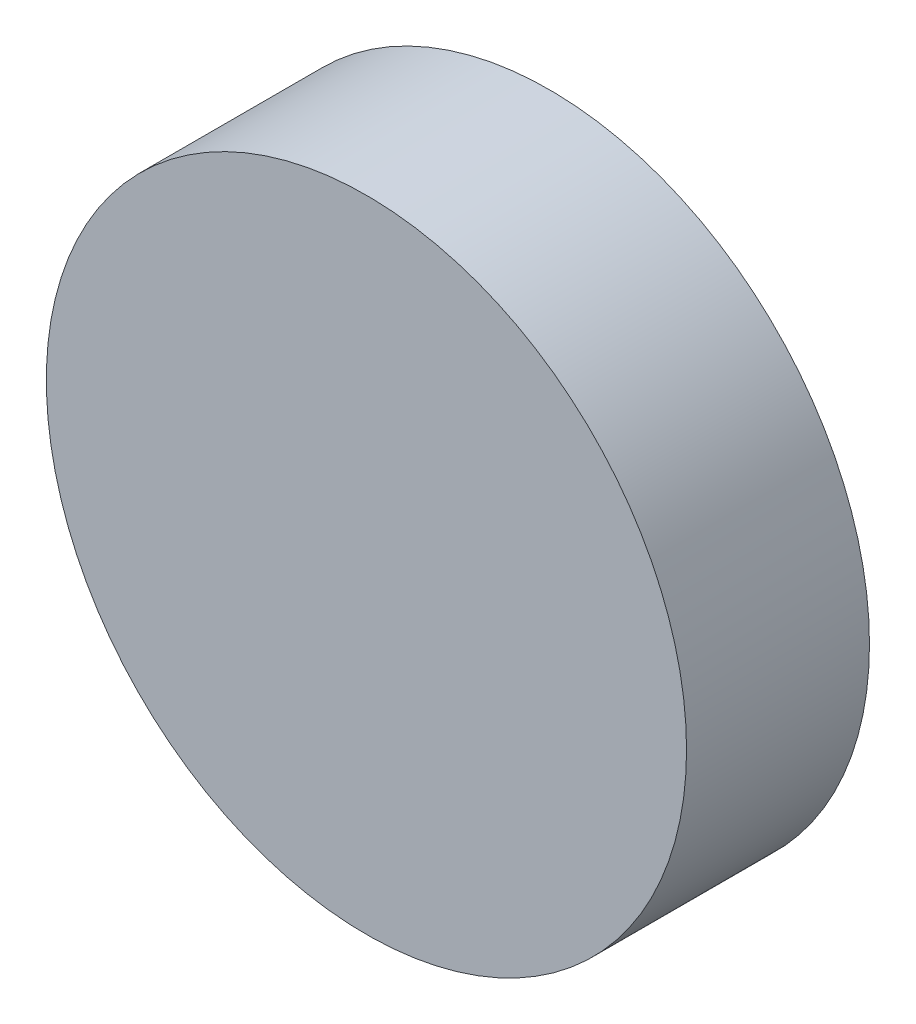
ISO-10303-21;
HEADER;
FILE_DESCRIPTION(('STEP AP214'),'2;1');
FILE_NAME('part.step','',(''),(''),'','','');
FILE_SCHEMA(('AUTOMOTIVE_DESIGN { 1 0 10303 214 1 1 1 1 }'));
ENDSEC;
DATA;
#1=APPLICATION_CONTEXT('core data for automotive mechanical design processes');
#2=APPLICATION_PROTOCOL_DEFINITION('international standard','automotive_design',2000,#1);
#3=PRODUCT_CONTEXT('',#1,'mechanical');
#4=PRODUCT('Part','Part','',(#3));
#5=PRODUCT_RELATED_PRODUCT_CATEGORY('part','',(#4));
#6=PRODUCT_DEFINITION_FORMATION('','',#4);
#7=PRODUCT_DEFINITION_CONTEXT('part definition',#1,'design');
#8=PRODUCT_DEFINITION('design','',#6,#7);
#9=PRODUCT_DEFINITION_SHAPE('','',#8);
#10=(LENGTH_UNIT() NAMED_UNIT(*) SI_UNIT(.MILLI.,.METRE.));
#11=(NAMED_UNIT(*) PLANE_ANGLE_UNIT() SI_UNIT($,.RADIAN.));
#12=(NAMED_UNIT(*) SI_UNIT($,.STERADIAN.) SOLID_ANGLE_UNIT());
#13=UNCERTAINTY_MEASURE_WITH_UNIT(LENGTH_MEASURE(1.E-05),#10,'distance_accuracy_value','');
#14=(GEOMETRIC_REPRESENTATION_CONTEXT(3) GLOBAL_UNCERTAINTY_ASSIGNED_CONTEXT((#13)) GLOBAL_UNIT_ASSIGNED_CONTEXT((#10,
#11,#12)) REPRESENTATION_CONTEXT('',''));
#15=CARTESIAN_POINT('',(0.,0.,0.));
#16=DIRECTION('',(0.,0.,1.));
#17=DIRECTION('',(1.,0.,0.));
#18=AXIS2_PLACEMENT_3D('',#15,#16,#17);
#19=CARTESIAN_POINT('',(0.,0.,40.));
#20=DIRECTION('',(0.,0.,-1.));
#21=DIRECTION('',(-1.,0.,0.));
#22=AXIS2_PLACEMENT_3D('',#19,#20,#21);
#23=CYLINDRICAL_SURFACE('',#22,70.);
#24=CARTESIAN_POINT('',(0.,0.,40.));
#25=DIRECTION('',(0.,0.,1.));
#26=DIRECTION('',(1.,0.,0.));
#27=AXIS2_PLACEMENT_3D('',#24,#25,#26);
#28=CIRCLE('',#27,70.);
#29=CARTESIAN_POINT('',(70.,0.,40.));
#30=VERTEX_POINT('',#29);
#31=EDGE_CURVE('E10',#30,#30,#28,.T.);
#32=ORIENTED_EDGE('',*,*,#31,.F.);
#33=EDGE_LOOP('',(#32));
#34=FACE_BOUND('',#33,.T.);
#35=CARTESIAN_POINT('',(0.,0.,0.));
#36=DIRECTION('',(0.,0.,1.));
#37=DIRECTION('',(1.,0.,0.));
#38=AXIS2_PLACEMENT_3D('',#35,#36,#37);
#39=CIRCLE('',#38,70.);
#40=CARTESIAN_POINT('',(70.,0.,0.));
#41=VERTEX_POINT('',#40);
#42=EDGE_CURVE('E41',#41,#41,#39,.T.);
#43=ORIENTED_EDGE('',*,*,#42,.T.);
#44=EDGE_LOOP('',(#43));
#45=FACE_BOUND('',#44,.T.);
#46=ADVANCED_FACE('F38',(#34,#45),#23,.T.);
#47=CARTESIAN_POINT('',(0.,0.,40.));
#48=DIRECTION('',(0.,0.,1.));
#49=DIRECTION('',(1.,0.,0.));
#50=AXIS2_PLACEMENT_3D('',#47,#48,#49);
#51=PLANE('',#50);
#52=ORIENTED_EDGE('',*,*,#31,.T.);
#53=EDGE_LOOP('',(#52));
#54=FACE_BOUND('',#53,.T.);
#55=ADVANCED_FACE('F53',(#54),#51,.T.);
#56=CARTESIAN_POINT('',(0.,0.,0.));
#57=DIRECTION('',(0.,0.,1.));
#58=DIRECTION('',(1.,0.,0.));
#59=AXIS2_PLACEMENT_3D('',#56,#57,#58);
#60=PLANE('',#59);
#61=ORIENTED_EDGE('',*,*,#42,.F.);
#62=EDGE_LOOP('',(#61));
#63=FACE_BOUND('',#62,.T.);
#64=ADVANCED_FACE('F51',(#63),#60,.F.);
#65=CLOSED_SHELL('',(#46,#55,#64));
#66=MANIFOLD_SOLID_BREP('B2',#65);
#67=ADVANCED_BREP_SHAPE_REPRESENTATION('',(#18,#66),#14);
#68=SHAPE_DEFINITION_REPRESENTATION(#9,#67);
ENDSEC;
END-ISO-10303-21;
